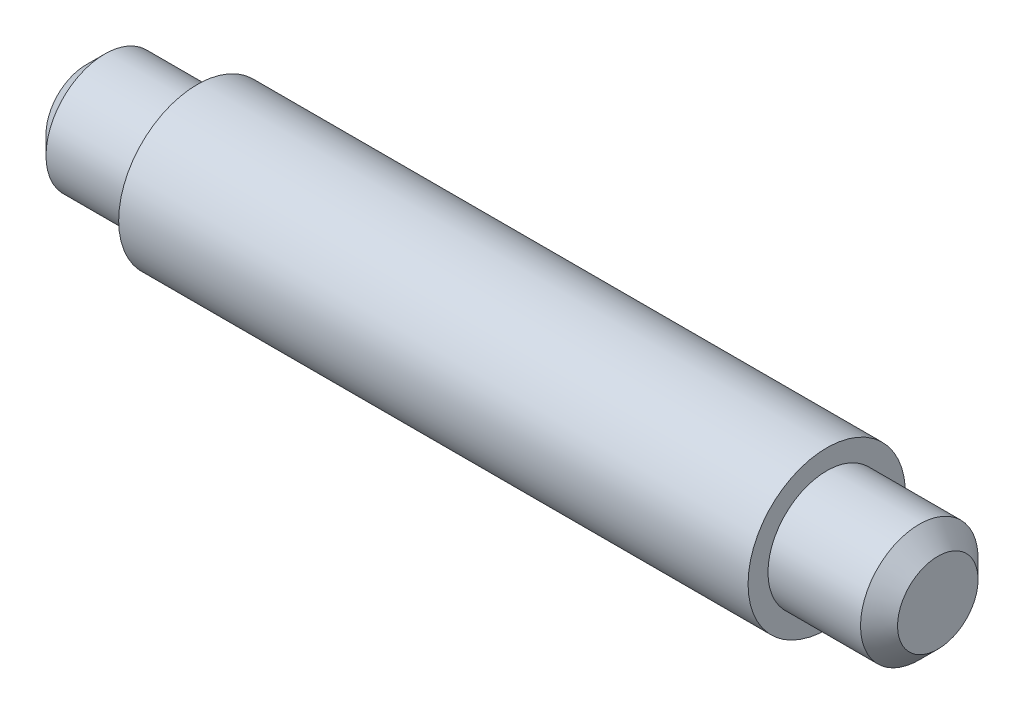
ISO-10303-21;
HEADER;
FILE_DESCRIPTION(('STEP AP214'),'2;1');
FILE_NAME('part.step','',(''),(''),'','','');
FILE_SCHEMA(('AUTOMOTIVE_DESIGN { 1 0 10303 214 1 1 1 1 }'));
ENDSEC;
DATA;
#1=APPLICATION_CONTEXT('core data for automotive mechanical design processes');
#2=APPLICATION_PROTOCOL_DEFINITION('international standard','automotive_design',2000,#1);
#3=PRODUCT_CONTEXT('',#1,'mechanical');
#4=PRODUCT('Part','Part','',(#3));
#5=PRODUCT_RELATED_PRODUCT_CATEGORY('part','',(#4));
#6=PRODUCT_DEFINITION_FORMATION('','',#4);
#7=PRODUCT_DEFINITION_CONTEXT('part definition',#1,'design');
#8=PRODUCT_DEFINITION('design','',#6,#7);
#9=PRODUCT_DEFINITION_SHAPE('','',#8);
#10=(LENGTH_UNIT() NAMED_UNIT(*) SI_UNIT(.MILLI.,.METRE.));
#11=(NAMED_UNIT(*) PLANE_ANGLE_UNIT() SI_UNIT($,.RADIAN.));
#12=(NAMED_UNIT(*) SI_UNIT($,.STERADIAN.) SOLID_ANGLE_UNIT());
#13=UNCERTAINTY_MEASURE_WITH_UNIT(LENGTH_MEASURE(1.E-05),#10,'distance_accuracy_value','');
#14=(GEOMETRIC_REPRESENTATION_CONTEXT(3) GLOBAL_UNCERTAINTY_ASSIGNED_CONTEXT((#13)) GLOBAL_UNIT_ASSIGNED_CONTEXT((#10,
#11,#12)) REPRESENTATION_CONTEXT('',''));
#15=CARTESIAN_POINT('',(0.,0.,0.));
#16=DIRECTION('',(0.,0.,1.));
#17=DIRECTION('',(1.,0.,0.));
#18=AXIS2_PLACEMENT_3D('',#15,#16,#17);
#19=CARTESIAN_POINT('',(0.,2.17499999999999,0.));
#20=DIRECTION('',(1.,0.,0.));
#21=DIRECTION('',(0.,0.,-1.));
#22=AXIS2_PLACEMENT_3D('',#19,#20,#21);
#23=PLANE('',#22);
#24=CARTESIAN_POINT('',(0.,0.,0.));
#25=DIRECTION('',(-1.,0.,0.));
#26=DIRECTION('',(0.,0.,1.));
#27=AXIS2_PLACEMENT_3D('',#24,#25,#26);
#28=CIRCLE('',#27,2.17499999999999);
#29=CARTESIAN_POINT('',(0.,0.,2.17499999999999));
#30=VERTEX_POINT('',#29);
#31=EDGE_CURVE('E75',#30,#30,#28,.T.);
#32=ORIENTED_EDGE('',*,*,#31,.T.);
#33=EDGE_LOOP('',(#32));
#34=FACE_BOUND('',#33,.T.);
#35=ADVANCED_FACE('F40',(#34),#23,.F.);
#36=CARTESIAN_POINT('',(46.,0.,0.));
#37=DIRECTION('',(-1.,0.,0.));
#38=DIRECTION('',(0.,0.,1.));
#39=AXIS2_PLACEMENT_3D('',#36,#37,#38);
#40=PLANE('',#39);
#41=CARTESIAN_POINT('',(46.,0.,0.));
#42=DIRECTION('',(-1.,0.,0.));
#43=DIRECTION('',(0.,0.,1.));
#44=AXIS2_PLACEMENT_3D('',#41,#42,#43);
#45=CIRCLE('',#44,2.175);
#46=CARTESIAN_POINT('',(46.,0.,2.175));
#47=VERTEX_POINT('',#46);
#48=EDGE_CURVE('E10',#47,#47,#45,.T.);
#49=ORIENTED_EDGE('',*,*,#48,.F.);
#50=EDGE_LOOP('',(#49));
#51=FACE_BOUND('',#50,.T.);
#52=ADVANCED_FACE('F118',(#51),#40,.F.);
#53=CARTESIAN_POINT('',(46.,0.,0.));
#54=DIRECTION('',(-1.,0.,0.));
#55=DIRECTION('',(0.,0.,1.));
#56=AXIS2_PLACEMENT_3D('',#53,#54,#55);
#57=CONICAL_SURFACE('',#56,2.175,0.785398163397448);
#58=CARTESIAN_POINT('',(45.,0.,0.));
#59=DIRECTION('',(-1.,0.,0.));
#60=DIRECTION('',(0.,0.,1.));
#61=AXIS2_PLACEMENT_3D('',#58,#59,#60);
#62=CIRCLE('',#61,3.175);
#63=CARTESIAN_POINT('',(45.,0.,3.175));
#64=VERTEX_POINT('',#63);
#65=EDGE_CURVE('E47',#64,#64,#62,.T.);
#66=ORIENTED_EDGE('',*,*,#65,.F.);
#67=EDGE_LOOP('',(#66));
#68=FACE_BOUND('',#67,.T.);
#69=ORIENTED_EDGE('',*,*,#48,.T.);
#70=EDGE_LOOP('',(#69));
#71=FACE_BOUND('',#70,.T.);
#72=ADVANCED_FACE('F113',(#68,#71),#57,.T.);
#73=CARTESIAN_POINT('',(0.,0.,0.));
#74=DIRECTION('',(-1.,0.,0.));
#75=DIRECTION('',(0.,0.,1.));
#76=AXIS2_PLACEMENT_3D('',#73,#74,#75);
#77=CYLINDRICAL_SURFACE('',#76,3.175);
#78=CARTESIAN_POINT('',(40.,0.,0.));
#79=DIRECTION('',(-1.,0.,0.));
#80=DIRECTION('',(0.,0.,1.));
#81=AXIS2_PLACEMENT_3D('',#78,#79,#80);
#82=CIRCLE('',#81,3.175);
#83=CARTESIAN_POINT('',(40.,0.,3.175));
#84=VERTEX_POINT('',#83);
#85=EDGE_CURVE('E52',#84,#84,#82,.T.);
#86=ORIENTED_EDGE('',*,*,#85,.F.);
#87=EDGE_LOOP('',(#86));
#88=FACE_BOUND('',#87,.T.);
#89=ORIENTED_EDGE('',*,*,#65,.T.);
#90=EDGE_LOOP('',(#89));
#91=FACE_BOUND('',#90,.T.);
#92=ADVANCED_FACE('F108',(#88,#91),#77,.T.);
#93=CARTESIAN_POINT('',(40.,3.175,0.));
#94=DIRECTION('',(-1.,0.,0.));
#95=DIRECTION('',(0.,0.,1.));
#96=AXIS2_PLACEMENT_3D('',#93,#94,#95);
#97=PLANE('',#96);
#98=CARTESIAN_POINT('',(40.,0.,0.));
#99=DIRECTION('',(-1.,0.,0.));
#100=DIRECTION('',(0.,0.,1.));
#101=AXIS2_PLACEMENT_3D('',#98,#99,#100);
#102=CIRCLE('',#101,4.25);
#103=CARTESIAN_POINT('',(40.,0.,4.25));
#104=VERTEX_POINT('',#103);
#105=EDGE_CURVE('E57',#104,#104,#102,.T.);
#106=ORIENTED_EDGE('',*,*,#105,.F.);
#107=EDGE_LOOP('',(#106));
#108=FACE_BOUND('',#107,.T.);
#109=ORIENTED_EDGE('',*,*,#85,.T.);
#110=EDGE_LOOP('',(#109));
#111=FACE_BOUND('',#110,.T.);
#112=ADVANCED_FACE('F102',(#108,#111),#97,.F.);
#113=CARTESIAN_POINT('',(0.,0.,0.));
#114=DIRECTION('',(-1.,0.,0.));
#115=DIRECTION('',(0.,0.,1.));
#116=AXIS2_PLACEMENT_3D('',#113,#114,#115);
#117=CYLINDRICAL_SURFACE('',#116,4.25);
#118=CARTESIAN_POINT('',(6.,0.,0.));
#119=DIRECTION('',(-1.,0.,0.));
#120=DIRECTION('',(0.,0.,1.));
#121=AXIS2_PLACEMENT_3D('',#118,#119,#120);
#122=CIRCLE('',#121,4.25);
#123=CARTESIAN_POINT('',(6.,0.,4.25));
#124=VERTEX_POINT('',#123);
#125=EDGE_CURVE('E63',#124,#124,#122,.T.);
#126=ORIENTED_EDGE('',*,*,#125,.F.);
#127=EDGE_LOOP('',(#126));
#128=FACE_BOUND('',#127,.T.);
#129=ORIENTED_EDGE('',*,*,#105,.T.);
#130=EDGE_LOOP('',(#129));
#131=FACE_BOUND('',#130,.T.);
#132=ADVANCED_FACE('F96',(#128,#131),#117,.T.);
#133=CARTESIAN_POINT('',(6.,4.25,0.));
#134=DIRECTION('',(1.,0.,0.));
#135=DIRECTION('',(0.,0.,-1.));
#136=AXIS2_PLACEMENT_3D('',#133,#134,#135);
#137=PLANE('',#136);
#138=CARTESIAN_POINT('',(6.,0.,0.));
#139=DIRECTION('',(-1.,0.,0.));
#140=DIRECTION('',(0.,0.,1.));
#141=AXIS2_PLACEMENT_3D('',#138,#139,#140);
#142=CIRCLE('',#141,3.17499999999999);
#143=CARTESIAN_POINT('',(6.,0.,3.17499999999999));
#144=VERTEX_POINT('',#143);
#145=EDGE_CURVE('E67',#144,#144,#142,.T.);
#146=ORIENTED_EDGE('',*,*,#145,.F.);
#147=EDGE_LOOP('',(#146));
#148=FACE_BOUND('',#147,.T.);
#149=ORIENTED_EDGE('',*,*,#125,.T.);
#150=EDGE_LOOP('',(#149));
#151=FACE_BOUND('',#150,.T.);
#152=ADVANCED_FACE('F90',(#148,#151),#137,.F.);
#153=CARTESIAN_POINT('',(0.,0.,0.));
#154=DIRECTION('',(-1.,0.,0.));
#155=DIRECTION('',(0.,0.,1.));
#156=AXIS2_PLACEMENT_3D('',#153,#154,#155);
#157=CYLINDRICAL_SURFACE('',#156,3.17499999999999);
#158=CARTESIAN_POINT('',(1.,0.,0.));
#159=DIRECTION('',(-1.,0.,0.));
#160=DIRECTION('',(0.,0.,1.));
#161=AXIS2_PLACEMENT_3D('',#158,#159,#160);
#162=CIRCLE('',#161,3.17499999999999);
#163=CARTESIAN_POINT('',(1.,0.,3.17499999999999));
#164=VERTEX_POINT('',#163);
#165=EDGE_CURVE('E71',#164,#164,#162,.T.);
#166=ORIENTED_EDGE('',*,*,#165,.F.);
#167=EDGE_LOOP('',(#166));
#168=FACE_BOUND('',#167,.T.);
#169=ORIENTED_EDGE('',*,*,#145,.T.);
#170=EDGE_LOOP('',(#169));
#171=FACE_BOUND('',#170,.T.);
#172=ADVANCED_FACE('F84',(#168,#171),#157,.T.);
#173=CARTESIAN_POINT('',(1.,0.,0.));
#174=DIRECTION('',(1.,0.,0.));
#175=DIRECTION('',(0.,0.,-1.));
#176=AXIS2_PLACEMENT_3D('',#173,#174,#175);
#177=CONICAL_SURFACE('',#176,3.17499999999999,0.785398163397448);
#178=ORIENTED_EDGE('',*,*,#31,.F.);
#179=EDGE_LOOP('',(#178));
#180=FACE_BOUND('',#179,.T.);
#181=ORIENTED_EDGE('',*,*,#165,.T.);
#182=EDGE_LOOP('',(#181));
#183=FACE_BOUND('',#182,.T.);
#184=ADVANCED_FACE('F81',(#180,#183),#177,.T.);
#185=CLOSED_SHELL('',(#35,#52,#72,#92,#112,#132,#152,#172,#184));
#186=MANIFOLD_SOLID_BREP('B2',#185);
#187=ADVANCED_BREP_SHAPE_REPRESENTATION('',(#18,#186),#14);
#188=SHAPE_DEFINITION_REPRESENTATION(#9,#187);
ENDSEC;
END-ISO-10303-21;
